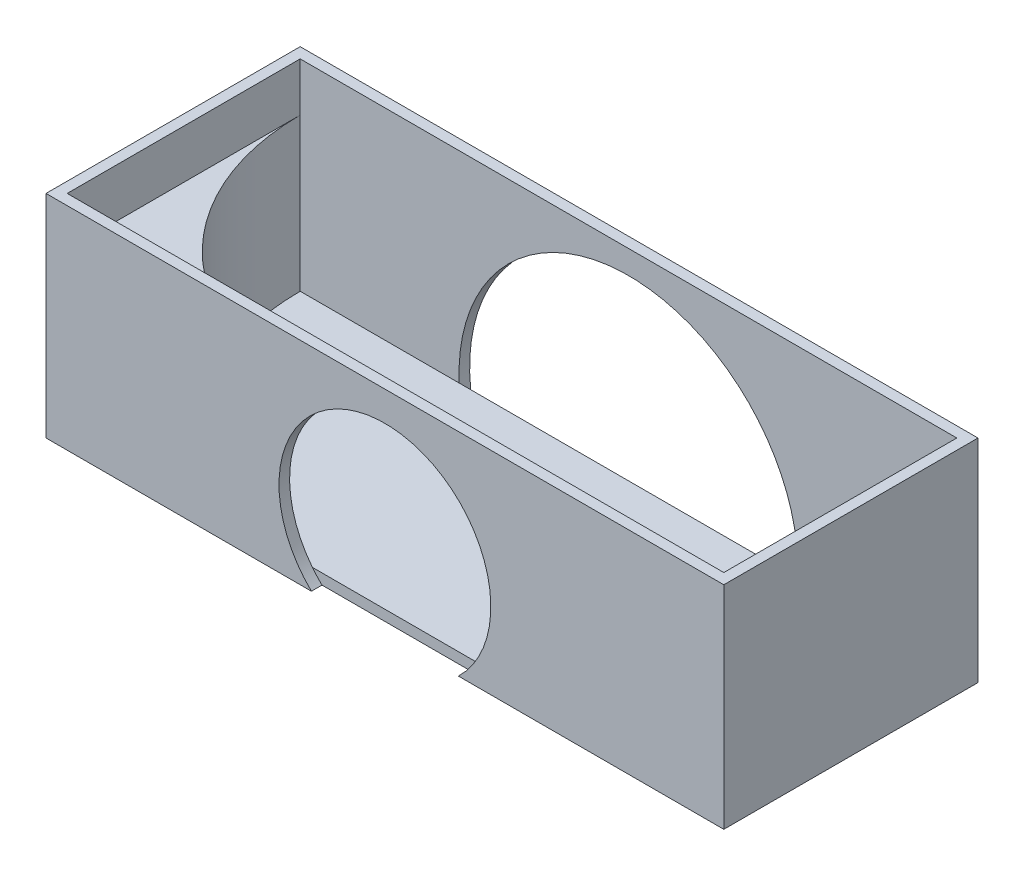
ISO-10303-21;
HEADER;
FILE_DESCRIPTION(('STEP AP214'),'2;1');
FILE_NAME('part.step','',(''),(''),'','','');
FILE_SCHEMA(('AUTOMOTIVE_DESIGN { 1 0 10303 214 1 1 1 1 }'));
ENDSEC;
DATA;
#1=APPLICATION_CONTEXT('core data for automotive mechanical design processes');
#2=APPLICATION_PROTOCOL_DEFINITION('international standard','automotive_design',2000,#1);
#3=PRODUCT_CONTEXT('',#1,'mechanical');
#4=PRODUCT('Part','Part','',(#3));
#5=PRODUCT_RELATED_PRODUCT_CATEGORY('part','',(#4));
#6=PRODUCT_DEFINITION_FORMATION('','',#4);
#7=PRODUCT_DEFINITION_CONTEXT('part definition',#1,'design');
#8=PRODUCT_DEFINITION('design','',#6,#7);
#9=PRODUCT_DEFINITION_SHAPE('','',#8);
#10=(LENGTH_UNIT() NAMED_UNIT(*) SI_UNIT(.MILLI.,.METRE.));
#11=(NAMED_UNIT(*) PLANE_ANGLE_UNIT() SI_UNIT($,.RADIAN.));
#12=(NAMED_UNIT(*) SI_UNIT($,.STERADIAN.) SOLID_ANGLE_UNIT());
#13=UNCERTAINTY_MEASURE_WITH_UNIT(LENGTH_MEASURE(1.E-05),#10,'distance_accuracy_value','');
#14=(GEOMETRIC_REPRESENTATION_CONTEXT(3) GLOBAL_UNCERTAINTY_ASSIGNED_CONTEXT((#13)) GLOBAL_UNIT_ASSIGNED_CONTEXT((#10,
#11,#12)) REPRESENTATION_CONTEXT('',''));
#15=CARTESIAN_POINT('',(0.,0.,0.));
#16=DIRECTION('',(0.,0.,1.));
#17=DIRECTION('',(1.,0.,0.));
#18=AXIS2_PLACEMENT_3D('',#15,#16,#17);
#19=CARTESIAN_POINT('',(-27.5622111628597,48.895,-34.925));
#20=DIRECTION('',(0.,-1.,0.));
#21=DIRECTION('',(0.,0.,-1.));
#22=AXIS2_PLACEMENT_3D('',#19,#20,#21);
#23=CYLINDRICAL_SURFACE('',#22,70.8627888371403);
#24=CARTESIAN_POINT('',(-27.5622111628597,3.175,-34.925));
#25=DIRECTION('',(0.,-1.,0.));
#26=DIRECTION('',(0.,0.,1.));
#27=AXIS2_PLACEMENT_3D('',#24,#25,#26);
#28=CIRCLE('',#27,70.8627888371403);
#29=CARTESIAN_POINT('',(-39.5000644781395,3.175,34.925));
#30=VERTEX_POINT('',#29);
#31=CARTESIAN_POINT('',(-98.425,3.175,-34.925));
#32=VERTEX_POINT('',#31);
#33=EDGE_CURVE('E100',#30,#32,#28,.T.);
#34=ORIENTED_EDGE('',*,*,#33,.T.);
#35=DIRECTION('',(0.,-1.,0.));
#36=VECTOR('',#35,1.);
#37=CARTESIAN_POINT('',(-98.425,48.895,-34.925));
#38=LINE('',#37,#36);
#39=CARTESIAN_POINT('',(-98.425,48.895,-34.925));
#40=VERTEX_POINT('',#39);
#41=EDGE_CURVE('E12',#40,#32,#38,.T.);
#42=ORIENTED_EDGE('',*,*,#41,.F.);
#43=CARTESIAN_POINT('',(-27.5622111628597,48.895,-34.925));
#44=DIRECTION('',(0.,-1.,0.));
#45=DIRECTION('',(0.,0.,1.));
#46=AXIS2_PLACEMENT_3D('',#43,#44,#45);
#47=CIRCLE('',#46,70.8627888371403);
#48=CARTESIAN_POINT('',(-39.5000644781395,48.895,34.925));
#49=VERTEX_POINT('',#48);
#50=EDGE_CURVE('E93',#49,#40,#47,.T.);
#51=ORIENTED_EDGE('',*,*,#50,.F.);
#52=DIRECTION('',(0.,-1.,0.));
#53=VECTOR('',#52,1.);
#54=CARTESIAN_POINT('',(-39.5000644781395,48.895,34.925));
#55=LINE('',#54,#53);
#56=EDGE_CURVE('E101',#49,#30,#55,.T.);
#57=ORIENTED_EDGE('',*,*,#56,.T.);
#58=EDGE_LOOP('',(#34,#42,#51,#57));
#59=FACE_BOUND('',#58,.T.);
#60=ADVANCED_FACE('F53',(#59),#23,.F.);
#61=CARTESIAN_POINT('',(-98.425,48.895,-34.925));
#62=DIRECTION('',(1.,0.,0.));
#63=DIRECTION('',(0.,0.,-1.));
#64=AXIS2_PLACEMENT_3D('',#61,#62,#63);
#65=PLANE('',#64);
#66=DIRECTION('',(0.,0.,1.));
#67=VECTOR('',#66,1.);
#68=CARTESIAN_POINT('',(-98.425,3.175,-34.925));
#69=LINE('',#68,#67);
#70=CARTESIAN_POINT('',(-98.425,3.175,34.925));
#71=VERTEX_POINT('',#70);
#72=EDGE_CURVE('E81',#32,#71,#69,.T.);
#73=ORIENTED_EDGE('',*,*,#72,.T.);
#74=DIRECTION('',(0.,-1.,0.));
#75=VECTOR('',#74,1.);
#76=CARTESIAN_POINT('',(-98.425,48.895,34.925));
#77=LINE('',#76,#75);
#78=CARTESIAN_POINT('',(-98.425,48.895,34.925));
#79=VERTEX_POINT('',#78);
#80=EDGE_CURVE('E61',#79,#71,#77,.T.);
#81=ORIENTED_EDGE('',*,*,#80,.F.);
#82=DIRECTION('',(0.,0.,1.));
#83=VECTOR('',#82,1.);
#84=CARTESIAN_POINT('',(-98.425,48.895,-34.925));
#85=LINE('',#84,#83);
#86=EDGE_CURVE('E89',#40,#79,#85,.T.);
#87=ORIENTED_EDGE('',*,*,#86,.F.);
#88=ORIENTED_EDGE('',*,*,#41,.T.);
#89=EDGE_LOOP('',(#73,#81,#87,#88));
#90=FACE_BOUND('',#89,.T.);
#91=ADVANCED_FACE('F90',(#90),#65,.F.);
#92=CARTESIAN_POINT('',(-98.425,48.895,34.925));
#93=DIRECTION('',(0.,0.,-1.));
#94=DIRECTION('',(-1.,0.,0.));
#95=AXIS2_PLACEMENT_3D('',#92,#93,#94);
#96=PLANE('',#95);
#97=DIRECTION('',(1.,0.,0.));
#98=VECTOR('',#97,1.);
#99=CARTESIAN_POINT('',(-98.425,3.175,34.925));
#100=LINE('',#99,#98);
#101=EDGE_CURVE('E86',#71,#30,#100,.T.);
#102=ORIENTED_EDGE('',*,*,#101,.T.);
#103=ORIENTED_EDGE('',*,*,#56,.F.);
#104=DIRECTION('',(1.,0.,0.));
#105=VECTOR('',#104,1.);
#106=CARTESIAN_POINT('',(-98.425,48.895,34.925));
#107=LINE('',#106,#105);
#108=EDGE_CURVE('E69',#79,#49,#107,.T.);
#109=ORIENTED_EDGE('',*,*,#108,.F.);
#110=ORIENTED_EDGE('',*,*,#80,.T.);
#111=EDGE_LOOP('',(#102,#103,#109,#110));
#112=FACE_BOUND('',#111,.T.);
#113=ADVANCED_FACE('F108',(#112),#96,.F.);
#114=CARTESIAN_POINT('',(-27.5622111628597,48.895,-34.925));
#115=DIRECTION('',(0.,1.,0.));
#116=DIRECTION('',(0.,0.,1.));
#117=AXIS2_PLACEMENT_3D('',#114,#115,#116);
#118=PLANE('',#117);
#119=ORIENTED_EDGE('',*,*,#50,.T.);
#120=ORIENTED_EDGE('',*,*,#86,.T.);
#121=ORIENTED_EDGE('',*,*,#108,.T.);
#122=EDGE_LOOP('',(#119,#120,#121));
#123=FACE_BOUND('',#122,.T.);
#124=ADVANCED_FACE('F96',(#123),#118,.T.);
#125=CARTESIAN_POINT('',(-27.5622111628597,3.175,-34.925));
#126=DIRECTION('',(0.,1.,0.));
#127=DIRECTION('',(0.,0.,1.));
#128=AXIS2_PLACEMENT_3D('',#125,#126,#127);
#129=PLANE('',#128);
#130=ORIENTED_EDGE('',*,*,#33,.F.);
#131=ORIENTED_EDGE('',*,*,#101,.F.);
#132=ORIENTED_EDGE('',*,*,#72,.F.);
#133=EDGE_LOOP('',(#130,#131,#132));
#134=FACE_BOUND('',#133,.T.);
#135=ADVANCED_FACE('F109',(#134),#129,.F.);
#136=CLOSED_SHELL('',(#60,#91,#113,#124,#135));
#137=MANIFOLD_SOLID_BREP('B2',#136);
#138=CARTESIAN_POINT('',(-101.6,63.5,38.1));
#139=DIRECTION('',(1.,0.,0.));
#140=DIRECTION('',(0.,0.,-1.));
#141=AXIS2_PLACEMENT_3D('',#138,#139,#140);
#142=PLANE('',#141);
#143=DIRECTION('',(0.,0.,1.));
#144=VECTOR('',#143,1.);
#145=CARTESIAN_POINT('',(-101.6,0.,38.1));
#146=LINE('',#145,#144);
#147=CARTESIAN_POINT('',(-101.6,0.,-38.1));
#148=VERTEX_POINT('',#147);
#149=CARTESIAN_POINT('',(-101.6,0.,38.1));
#150=VERTEX_POINT('',#149);
#151=EDGE_CURVE('E293',#148,#150,#146,.T.);
#152=ORIENTED_EDGE('',*,*,#151,.T.);
#153=DIRECTION('',(0.,-1.,0.));
#154=VECTOR('',#153,1.);
#155=CARTESIAN_POINT('',(-101.6,63.5,38.1));
#156=LINE('',#155,#154);
#157=CARTESIAN_POINT('',(-101.6,63.5,38.1));
#158=VERTEX_POINT('',#157);
#159=EDGE_CURVE('E51',#158,#150,#156,.T.);
#160=ORIENTED_EDGE('',*,*,#159,.F.);
#161=DIRECTION('',(0.,0.,1.));
#162=VECTOR('',#161,1.);
#163=CARTESIAN_POINT('',(-101.6,63.5,38.1));
#164=LINE('',#163,#162);
#165=CARTESIAN_POINT('',(-101.6,63.5,-38.1));
#166=VERTEX_POINT('',#165);
#167=EDGE_CURVE('E312',#166,#158,#164,.T.);
#168=ORIENTED_EDGE('',*,*,#167,.F.);
#169=DIRECTION('',(0.,-1.,0.));
#170=VECTOR('',#169,1.);
#171=CARTESIAN_POINT('',(-101.6,63.5,-38.1));
#172=LINE('',#171,#170);
#173=EDGE_CURVE('E322',#166,#148,#172,.T.);
#174=ORIENTED_EDGE('',*,*,#173,.T.);
#175=EDGE_LOOP('',(#152,#160,#168,#174));
#176=FACE_BOUND('',#175,.T.);
#177=ADVANCED_FACE('F156',(#176),#142,.F.);
#178=CARTESIAN_POINT('',(101.6,63.5,38.1));
#179=DIRECTION('',(0.,0.,-1.));
#180=DIRECTION('',(-1.,0.,0.));
#181=AXIS2_PLACEMENT_3D('',#178,#179,#180);
#182=PLANE('',#181);
#183=DIRECTION('',(1.,0.,0.));
#184=VECTOR('',#183,1.);
#185=CARTESIAN_POINT('',(101.6,0.,38.1));
#186=LINE('',#185,#184);
#187=CARTESIAN_POINT('',(-22.0336764975798,0.,38.1));
#188=VERTEX_POINT('',#187);
#189=EDGE_CURVE('E326',#150,#188,#186,.T.);
#190=ORIENTED_EDGE('',*,*,#189,.T.);
#191=CARTESIAN_POINT('',(0.,22.86,38.1));
#192=DIRECTION('',(0.,0.,1.));
#193=DIRECTION('',(1.,0.,0.));
#194=AXIS2_PLACEMENT_3D('',#191,#192,#193);
#195=CIRCLE('',#194,31.75);
#196=CARTESIAN_POINT('',(22.0336764975798,0.,38.1));
#197=VERTEX_POINT('',#196);
#198=EDGE_CURVE('E275',#197,#188,#195,.T.);
#199=ORIENTED_EDGE('',*,*,#198,.F.);
#200=CARTESIAN_POINT('',(101.6,0.,38.1));
#201=VERTEX_POINT('',#200);
#202=EDGE_CURVE('E325',#197,#201,#186,.T.);
#203=ORIENTED_EDGE('',*,*,#202,.T.);
#204=DIRECTION('',(0.,-1.,0.));
#205=VECTOR('',#204,1.);
#206=CARTESIAN_POINT('',(101.6,63.5,38.1));
#207=LINE('',#206,#205);
#208=CARTESIAN_POINT('',(101.6,63.5,38.1));
#209=VERTEX_POINT('',#208);
#210=EDGE_CURVE('E163',#209,#201,#207,.T.);
#211=ORIENTED_EDGE('',*,*,#210,.F.);
#212=DIRECTION('',(1.,0.,0.));
#213=VECTOR('',#212,1.);
#214=CARTESIAN_POINT('',(101.6,63.5,38.1));
#215=LINE('',#214,#213);
#216=EDGE_CURVE('E315',#158,#209,#215,.T.);
#217=ORIENTED_EDGE('',*,*,#216,.F.);
#218=ORIENTED_EDGE('',*,*,#159,.T.);
#219=EDGE_LOOP('',(#190,#199,#203,#211,#217,#218));
#220=FACE_BOUND('',#219,.T.);
#221=ADVANCED_FACE('F364',(#220),#182,.F.);
#222=CARTESIAN_POINT('',(101.6,63.5,38.1));
#223=DIRECTION('',(-1.,0.,0.));
#224=DIRECTION('',(0.,0.,1.));
#225=AXIS2_PLACEMENT_3D('',#222,#223,#224);
#226=PLANE('',#225);
#227=DIRECTION('',(0.,0.,-1.));
#228=VECTOR('',#227,1.);
#229=CARTESIAN_POINT('',(101.6,0.,38.1));
#230=LINE('',#229,#228);
#231=CARTESIAN_POINT('',(101.6,0.,-38.1));
#232=VERTEX_POINT('',#231);
#233=EDGE_CURVE('E329',#201,#232,#230,.T.);
#234=ORIENTED_EDGE('',*,*,#233,.T.);
#235=DIRECTION('',(0.,-1.,0.));
#236=VECTOR('',#235,1.);
#237=CARTESIAN_POINT('',(101.6,63.5,-38.1));
#238=LINE('',#237,#236);
#239=CARTESIAN_POINT('',(101.6,63.5,-38.1));
#240=VERTEX_POINT('',#239);
#241=EDGE_CURVE('E336',#240,#232,#238,.T.);
#242=ORIENTED_EDGE('',*,*,#241,.F.);
#243=DIRECTION('',(0.,0.,-1.));
#244=VECTOR('',#243,1.);
#245=CARTESIAN_POINT('',(101.6,63.5,38.1));
#246=LINE('',#245,#244);
#247=EDGE_CURVE('E318',#209,#240,#246,.T.);
#248=ORIENTED_EDGE('',*,*,#247,.F.);
#249=ORIENTED_EDGE('',*,*,#210,.T.);
#250=EDGE_LOOP('',(#234,#242,#248,#249));
#251=FACE_BOUND('',#250,.T.);
#252=ADVANCED_FACE('F343',(#251),#226,.F.);
#253=CARTESIAN_POINT('',(101.6,63.5,-38.1));
#254=DIRECTION('',(0.,0.,1.));
#255=DIRECTION('',(1.,0.,0.));
#256=AXIS2_PLACEMENT_3D('',#253,#254,#255);
#257=PLANE('',#256);
#258=DIRECTION('',(-1.,0.,0.));
#259=VECTOR('',#258,1.);
#260=CARTESIAN_POINT('',(101.6,0.,-38.1));
#261=LINE('',#260,#259);
#262=CARTESIAN_POINT('',(50.4821860232446,0.,-38.1));
#263=VERTEX_POINT('',#262);
#264=EDGE_CURVE('E316',#232,#263,#261,.T.);
#265=ORIENTED_EDGE('',*,*,#264,.T.);
#266=CARTESIAN_POINT('',(0.,5.67352573930252,-38.1));
#267=DIRECTION('',(0.,0.,-1.));
#268=DIRECTION('',(1.,0.,0.));
#269=AXIS2_PLACEMENT_3D('',#266,#267,#268);
#270=CIRCLE('',#269,50.8);
#271=CARTESIAN_POINT('',(-50.4821860232446,0.,-38.1));
#272=VERTEX_POINT('',#271);
#273=EDGE_CURVE('E356',#272,#263,#270,.T.);
#274=ORIENTED_EDGE('',*,*,#273,.F.);
#275=EDGE_CURVE('E331',#272,#148,#261,.T.);
#276=ORIENTED_EDGE('',*,*,#275,.T.);
#277=ORIENTED_EDGE('',*,*,#173,.F.);
#278=DIRECTION('',(-1.,0.,0.));
#279=VECTOR('',#278,1.);
#280=CARTESIAN_POINT('',(101.6,63.5,-38.1));
#281=LINE('',#280,#279);
#282=EDGE_CURVE('E320',#240,#166,#281,.T.);
#283=ORIENTED_EDGE('',*,*,#282,.F.);
#284=ORIENTED_EDGE('',*,*,#241,.T.);
#285=EDGE_LOOP('',(#265,#274,#276,#277,#283,#284));
#286=FACE_BOUND('',#285,.T.);
#287=ADVANCED_FACE('F355',(#286),#257,.F.);
#288=CARTESIAN_POINT('',(0.,63.5,0.));
#289=DIRECTION('',(0.,1.,0.));
#290=DIRECTION('',(0.,0.,1.));
#291=AXIS2_PLACEMENT_3D('',#288,#289,#290);
#292=PLANE('',#291);
#293=DIRECTION('',(0.,0.,1.));
#294=VECTOR('',#293,1.);
#295=CARTESIAN_POINT('',(-98.425,63.5,38.1));
#296=LINE('',#295,#294);
#297=CARTESIAN_POINT('',(-98.425,63.5,-34.925));
#298=VERTEX_POINT('',#297);
#299=CARTESIAN_POINT('',(-98.425,63.5,34.925));
#300=VERTEX_POINT('',#299);
#301=EDGE_CURVE('E393',#298,#300,#296,.T.);
#302=ORIENTED_EDGE('',*,*,#301,.F.);
#303=DIRECTION('',(-1.,0.,0.));
#304=VECTOR('',#303,1.);
#305=CARTESIAN_POINT('',(101.6,63.5,-34.925));
#306=LINE('',#305,#304);
#307=CARTESIAN_POINT('',(98.425,63.5,-34.925));
#308=VERTEX_POINT('',#307);
#309=EDGE_CURVE('E298',#308,#298,#306,.T.);
#310=ORIENTED_EDGE('',*,*,#309,.F.);
#311=DIRECTION('',(0.,0.,-1.));
#312=VECTOR('',#311,1.);
#313=CARTESIAN_POINT('',(98.425,63.5,38.1));
#314=LINE('',#313,#312);
#315=CARTESIAN_POINT('',(98.425,63.5,34.925));
#316=VERTEX_POINT('',#315);
#317=EDGE_CURVE('E304',#316,#308,#314,.T.);
#318=ORIENTED_EDGE('',*,*,#317,.F.);
#319=DIRECTION('',(1.,0.,0.));
#320=VECTOR('',#319,1.);
#321=CARTESIAN_POINT('',(101.6,63.5,34.925));
#322=LINE('',#321,#320);
#323=EDGE_CURVE('E308',#300,#316,#322,.T.);
#324=ORIENTED_EDGE('',*,*,#323,.F.);
#325=EDGE_LOOP('',(#302,#310,#318,#324));
#326=FACE_BOUND('',#325,.T.);
#327=ORIENTED_EDGE('',*,*,#167,.T.);
#328=ORIENTED_EDGE('',*,*,#216,.T.);
#329=ORIENTED_EDGE('',*,*,#247,.T.);
#330=ORIENTED_EDGE('',*,*,#282,.T.);
#331=EDGE_LOOP('',(#327,#328,#329,#330));
#332=FACE_BOUND('',#331,.T.);
#333=ADVANCED_FACE('F362',(#326,#332),#292,.T.);
#334=CARTESIAN_POINT('',(0.,0.,0.));
#335=DIRECTION('',(0.,1.,0.));
#336=DIRECTION('',(0.,0.,1.));
#337=AXIS2_PLACEMENT_3D('',#334,#335,#336);
#338=PLANE('',#337);
#339=DIRECTION('',(-1.,0.,0.));
#340=VECTOR('',#339,1.);
#341=CARTESIAN_POINT('',(0.,0.,34.925));
#342=LINE('',#341,#340);
#343=CARTESIAN_POINT('',(22.0336764975798,0.,34.925));
#344=VERTEX_POINT('',#343);
#345=CARTESIAN_POINT('',(-22.0336764975798,0.,34.925));
#346=VERTEX_POINT('',#345);
#347=EDGE_CURVE('E268',#344,#346,#342,.T.);
#348=ORIENTED_EDGE('',*,*,#347,.T.);
#349=DIRECTION('',(0.,0.,1.));
#350=VECTOR('',#349,1.);
#351=CARTESIAN_POINT('',(-22.0336764975798,0.,-54.8775612106915));
#352=LINE('',#351,#350);
#353=EDGE_CURVE('E267',#346,#188,#352,.T.);
#354=ORIENTED_EDGE('',*,*,#353,.T.);
#355=ORIENTED_EDGE('',*,*,#189,.F.);
#356=ORIENTED_EDGE('',*,*,#151,.F.);
#357=ORIENTED_EDGE('',*,*,#275,.F.);
#358=DIRECTION('',(0.,0.,-1.));
#359=VECTOR('',#358,1.);
#360=CARTESIAN_POINT('',(-50.4821860232446,0.,81.3153506078146));
#361=LINE('',#360,#359);
#362=CARTESIAN_POINT('',(-50.4821860232446,0.,-34.925));
#363=VERTEX_POINT('',#362);
#364=EDGE_CURVE('E377',#363,#272,#361,.T.);
#365=ORIENTED_EDGE('',*,*,#364,.F.);
#366=DIRECTION('',(-1.,0.,0.));
#367=VECTOR('',#366,1.);
#368=CARTESIAN_POINT('',(50.4821860232446,0.,-34.925));
#369=LINE('',#368,#367);
#370=CARTESIAN_POINT('',(50.4821860232446,0.,-34.925));
#371=VERTEX_POINT('',#370);
#372=EDGE_CURVE('E371',#371,#363,#369,.T.);
#373=ORIENTED_EDGE('',*,*,#372,.F.);
#374=DIRECTION('',(0.,0.,-1.));
#375=VECTOR('',#374,1.);
#376=CARTESIAN_POINT('',(50.4821860232446,0.,81.3153506078146));
#377=LINE('',#376,#375);
#378=EDGE_CURVE('E285',#371,#263,#377,.T.);
#379=ORIENTED_EDGE('',*,*,#378,.T.);
#380=ORIENTED_EDGE('',*,*,#264,.F.);
#381=ORIENTED_EDGE('',*,*,#233,.F.);
#382=ORIENTED_EDGE('',*,*,#202,.F.);
#383=DIRECTION('',(0.,0.,1.));
#384=VECTOR('',#383,1.);
#385=CARTESIAN_POINT('',(22.0336764975798,0.,-54.8775612106915));
#386=LINE('',#385,#384);
#387=EDGE_CURVE('E369',#197,#344,#386,.F.);
#388=ORIENTED_EDGE('',*,*,#387,.T.);
#389=EDGE_LOOP('',(#348,#354,#355,#356,#357,#365,#373,#379,#380,#381,#382,#388));
#390=FACE_BOUND('',#389,.T.);
#391=ADVANCED_FACE('F349',(#390),#338,.F.);
#392=CARTESIAN_POINT('',(-98.425,63.5,38.1));
#393=DIRECTION('',(1.,0.,0.));
#394=DIRECTION('',(0.,0.,-1.));
#395=AXIS2_PLACEMENT_3D('',#392,#393,#394);
#396=PLANE('',#395);
#397=DIRECTION('',(0.,0.,1.));
#398=VECTOR('',#397,1.);
#399=CARTESIAN_POINT('',(-98.425,3.175,38.1));
#400=LINE('',#399,#398);
#401=CARTESIAN_POINT('',(-98.425,3.175,-34.925));
#402=VERTEX_POINT('',#401);
#403=CARTESIAN_POINT('',(-98.425,3.175,34.925));
#404=VERTEX_POINT('',#403);
#405=EDGE_CURVE('E279',#402,#404,#400,.T.);
#406=ORIENTED_EDGE('',*,*,#405,.F.);
#407=DIRECTION('',(0.,-1.,0.));
#408=VECTOR('',#407,1.);
#409=CARTESIAN_POINT('',(-98.425,63.5,-34.925));
#410=LINE('',#409,#408);
#411=EDGE_CURVE('E295',#298,#402,#410,.T.);
#412=ORIENTED_EDGE('',*,*,#411,.F.);
#413=ORIENTED_EDGE('',*,*,#301,.T.);
#414=DIRECTION('',(0.,-1.,0.));
#415=VECTOR('',#414,1.);
#416=CARTESIAN_POINT('',(-98.425,63.5,34.925));
#417=LINE('',#416,#415);
#418=EDGE_CURVE('E292',#300,#404,#417,.T.);
#419=ORIENTED_EDGE('',*,*,#418,.T.);
#420=EDGE_LOOP('',(#406,#412,#413,#419));
#421=FACE_BOUND('',#420,.T.);
#422=ADVANCED_FACE('F404',(#421),#396,.T.);
#423=CARTESIAN_POINT('',(101.6,63.5,34.925));
#424=DIRECTION('',(0.,0.,-1.));
#425=DIRECTION('',(-1.,0.,0.));
#426=AXIS2_PLACEMENT_3D('',#423,#424,#425);
#427=PLANE('',#426);
#428=CARTESIAN_POINT('',(0.,22.86,34.925));
#429=DIRECTION('',(0.,0.,-1.));
#430=DIRECTION('',(-1.,0.,0.));
#431=AXIS2_PLACEMENT_3D('',#428,#429,#430);
#432=CIRCLE('',#431,31.75);
#433=CARTESIAN_POINT('',(24.911107462335,3.175,34.925));
#434=VERTEX_POINT('',#433);
#435=CARTESIAN_POINT('',(-24.9111074623349,3.175,34.925));
#436=VERTEX_POINT('',#435);
#437=EDGE_CURVE('E264',#434,#436,#432,.F.);
#438=ORIENTED_EDGE('',*,*,#437,.T.);
#439=DIRECTION('',(1.,0.,0.));
#440=VECTOR('',#439,1.);
#441=CARTESIAN_POINT('',(101.6,3.175,34.925));
#442=LINE('',#441,#440);
#443=EDGE_CURVE('E259',#404,#436,#442,.T.);
#444=ORIENTED_EDGE('',*,*,#443,.F.);
#445=ORIENTED_EDGE('',*,*,#418,.F.);
#446=ORIENTED_EDGE('',*,*,#323,.T.);
#447=DIRECTION('',(0.,-1.,0.));
#448=VECTOR('',#447,1.);
#449=CARTESIAN_POINT('',(98.425,63.5,34.925));
#450=LINE('',#449,#448);
#451=CARTESIAN_POINT('',(98.425,3.175,34.925));
#452=VERTEX_POINT('',#451);
#453=EDGE_CURVE('E294',#316,#452,#450,.T.);
#454=ORIENTED_EDGE('',*,*,#453,.T.);
#455=EDGE_CURVE('E260',#434,#452,#442,.T.);
#456=ORIENTED_EDGE('',*,*,#455,.F.);
#457=EDGE_LOOP('',(#438,#444,#445,#446,#454,#456));
#458=FACE_BOUND('',#457,.T.);
#459=ADVANCED_FACE('F271',(#458),#427,.T.);
#460=CARTESIAN_POINT('',(98.425,63.5,38.1));
#461=DIRECTION('',(-1.,0.,0.));
#462=DIRECTION('',(0.,0.,1.));
#463=AXIS2_PLACEMENT_3D('',#460,#461,#462);
#464=PLANE('',#463);
#465=DIRECTION('',(0.,0.,-1.));
#466=VECTOR('',#465,1.);
#467=CARTESIAN_POINT('',(98.425,3.175,38.1));
#468=LINE('',#467,#466);
#469=CARTESIAN_POINT('',(98.425,3.175,-34.925));
#470=VERTEX_POINT('',#469);
#471=EDGE_CURVE('E280',#452,#470,#468,.T.);
#472=ORIENTED_EDGE('',*,*,#471,.F.);
#473=ORIENTED_EDGE('',*,*,#453,.F.);
#474=ORIENTED_EDGE('',*,*,#317,.T.);
#475=DIRECTION('',(0.,-1.,0.));
#476=VECTOR('',#475,1.);
#477=CARTESIAN_POINT('',(98.425,63.5,-34.925));
#478=LINE('',#477,#476);
#479=EDGE_CURVE('E297',#308,#470,#478,.T.);
#480=ORIENTED_EDGE('',*,*,#479,.T.);
#481=EDGE_LOOP('',(#472,#473,#474,#480));
#482=FACE_BOUND('',#481,.T.);
#483=ADVANCED_FACE('F402',(#482),#464,.T.);
#484=CARTESIAN_POINT('',(101.6,63.5,-34.925));
#485=DIRECTION('',(0.,0.,1.));
#486=DIRECTION('',(1.,0.,0.));
#487=AXIS2_PLACEMENT_3D('',#484,#485,#486);
#488=PLANE('',#487);
#489=CARTESIAN_POINT('',(0.,5.67352573930252,-34.925));
#490=DIRECTION('',(0.,0.,1.));
#491=DIRECTION('',(1.,0.,0.));
#492=AXIS2_PLACEMENT_3D('',#489,#490,#491);
#493=CIRCLE('',#492,50.8);
#494=CARTESIAN_POINT('',(-50.7385195796058,3.175,-34.925));
#495=VERTEX_POINT('',#494);
#496=CARTESIAN_POINT('',(50.7385195796058,3.175,-34.925));
#497=VERTEX_POINT('',#496);
#498=EDGE_CURVE('E378',#495,#497,#493,.F.);
#499=ORIENTED_EDGE('',*,*,#498,.T.);
#500=DIRECTION('',(-1.,0.,0.));
#501=VECTOR('',#500,1.);
#502=CARTESIAN_POINT('',(101.6,3.175,-34.925));
#503=LINE('',#502,#501);
#504=EDGE_CURVE('E389',#470,#497,#503,.T.);
#505=ORIENTED_EDGE('',*,*,#504,.F.);
#506=ORIENTED_EDGE('',*,*,#479,.F.);
#507=ORIENTED_EDGE('',*,*,#309,.T.);
#508=ORIENTED_EDGE('',*,*,#411,.T.);
#509=EDGE_CURVE('E281',#495,#402,#503,.T.);
#510=ORIENTED_EDGE('',*,*,#509,.F.);
#511=EDGE_LOOP('',(#499,#505,#506,#507,#508,#510));
#512=FACE_BOUND('',#511,.T.);
#513=ADVANCED_FACE('F388',(#512),#488,.T.);
#514=CARTESIAN_POINT('',(0.,3.175,0.));
#515=DIRECTION('',(0.,1.,0.));
#516=DIRECTION('',(0.,0.,1.));
#517=AXIS2_PLACEMENT_3D('',#514,#515,#516);
#518=PLANE('',#517);
#519=ORIENTED_EDGE('',*,*,#405,.T.);
#520=ORIENTED_EDGE('',*,*,#443,.T.);
#521=EDGE_CURVE('E252',#436,#434,#442,.T.);
#522=ORIENTED_EDGE('',*,*,#521,.T.);
#523=ORIENTED_EDGE('',*,*,#455,.T.);
#524=ORIENTED_EDGE('',*,*,#471,.T.);
#525=ORIENTED_EDGE('',*,*,#504,.T.);
#526=EDGE_CURVE('E391',#497,#495,#503,.T.);
#527=ORIENTED_EDGE('',*,*,#526,.T.);
#528=ORIENTED_EDGE('',*,*,#509,.T.);
#529=EDGE_LOOP('',(#519,#520,#522,#523,#524,#525,#527,#528));
#530=FACE_BOUND('',#529,.T.);
#531=ADVANCED_FACE('F277',(#530),#518,.T.);
#532=CARTESIAN_POINT('',(101.6,63.5,-34.925));
#533=DIRECTION('',(0.,0.,1.));
#534=DIRECTION('',(1.,0.,0.));
#535=AXIS2_PLACEMENT_3D('',#532,#533,#534);
#536=PLANE('',#535);
#537=ORIENTED_EDGE('',*,*,#526,.F.);
#538=EDGE_CURVE('E379',#497,#371,#493,.F.);
#539=ORIENTED_EDGE('',*,*,#538,.T.);
#540=ORIENTED_EDGE('',*,*,#372,.T.);
#541=EDGE_CURVE('E288',#363,#495,#493,.F.);
#542=ORIENTED_EDGE('',*,*,#541,.T.);
#543=EDGE_LOOP('',(#537,#539,#540,#542));
#544=FACE_BOUND('',#543,.T.);
#545=ADVANCED_FACE('F429',(#544),#536,.F.);
#546=CARTESIAN_POINT('',(0.,5.67352573930252,81.3153506078146));
#547=DIRECTION('',(0.,0.,-1.));
#548=DIRECTION('',(-1.,0.,0.));
#549=AXIS2_PLACEMENT_3D('',#546,#547,#548);
#550=CYLINDRICAL_SURFACE('',#549,50.8);
#551=ORIENTED_EDGE('',*,*,#364,.T.);
#552=ORIENTED_EDGE('',*,*,#273,.T.);
#553=ORIENTED_EDGE('',*,*,#378,.F.);
#554=ORIENTED_EDGE('',*,*,#538,.F.);
#555=ORIENTED_EDGE('',*,*,#498,.F.);
#556=ORIENTED_EDGE('',*,*,#541,.F.);
#557=EDGE_LOOP('',(#551,#552,#553,#554,#555,#556));
#558=FACE_BOUND('',#557,.T.);
#559=ADVANCED_FACE('F453',(#558),#550,.F.);
#560=CARTESIAN_POINT('',(0.,22.86,-54.8775612106915));
#561=DIRECTION('',(0.,0.,1.));
#562=DIRECTION('',(1.,0.,0.));
#563=AXIS2_PLACEMENT_3D('',#560,#561,#562);
#564=CYLINDRICAL_SURFACE('',#563,31.75);
#565=EDGE_CURVE('E255',#436,#346,#432,.F.);
#566=ORIENTED_EDGE('',*,*,#565,.F.);
#567=ORIENTED_EDGE('',*,*,#437,.F.);
#568=EDGE_CURVE('E170',#344,#434,#432,.F.);
#569=ORIENTED_EDGE('',*,*,#568,.F.);
#570=ORIENTED_EDGE('',*,*,#387,.F.);
#571=ORIENTED_EDGE('',*,*,#198,.T.);
#572=ORIENTED_EDGE('',*,*,#353,.F.);
#573=EDGE_LOOP('',(#566,#567,#569,#570,#571,#572));
#574=FACE_BOUND('',#573,.T.);
#575=ADVANCED_FACE('F263',(#574),#564,.F.);
#576=CARTESIAN_POINT('',(101.6,63.5,34.925));
#577=DIRECTION('',(0.,0.,-1.));
#578=DIRECTION('',(-1.,0.,0.));
#579=AXIS2_PLACEMENT_3D('',#576,#577,#578);
#580=PLANE('',#579);
#581=ORIENTED_EDGE('',*,*,#568,.T.);
#582=ORIENTED_EDGE('',*,*,#521,.F.);
#583=ORIENTED_EDGE('',*,*,#565,.T.);
#584=ORIENTED_EDGE('',*,*,#347,.F.);
#585=EDGE_LOOP('',(#581,#582,#583,#584));
#586=FACE_BOUND('',#585,.T.);
#587=ADVANCED_FACE('F254',(#586),#580,.F.);
#588=CLOSED_SHELL('',(#177,#221,#252,#287,#333,#391,#422,#459,#483,#513,#531,#545,#559,#575,#587));
#589=MANIFOLD_SOLID_BREP('B6',#588);
#590=ADVANCED_BREP_SHAPE_REPRESENTATION('',(#18,#137,#589),#14);
#591=SHAPE_DEFINITION_REPRESENTATION(#9,#590);
ENDSEC;
END-ISO-10303-21;
